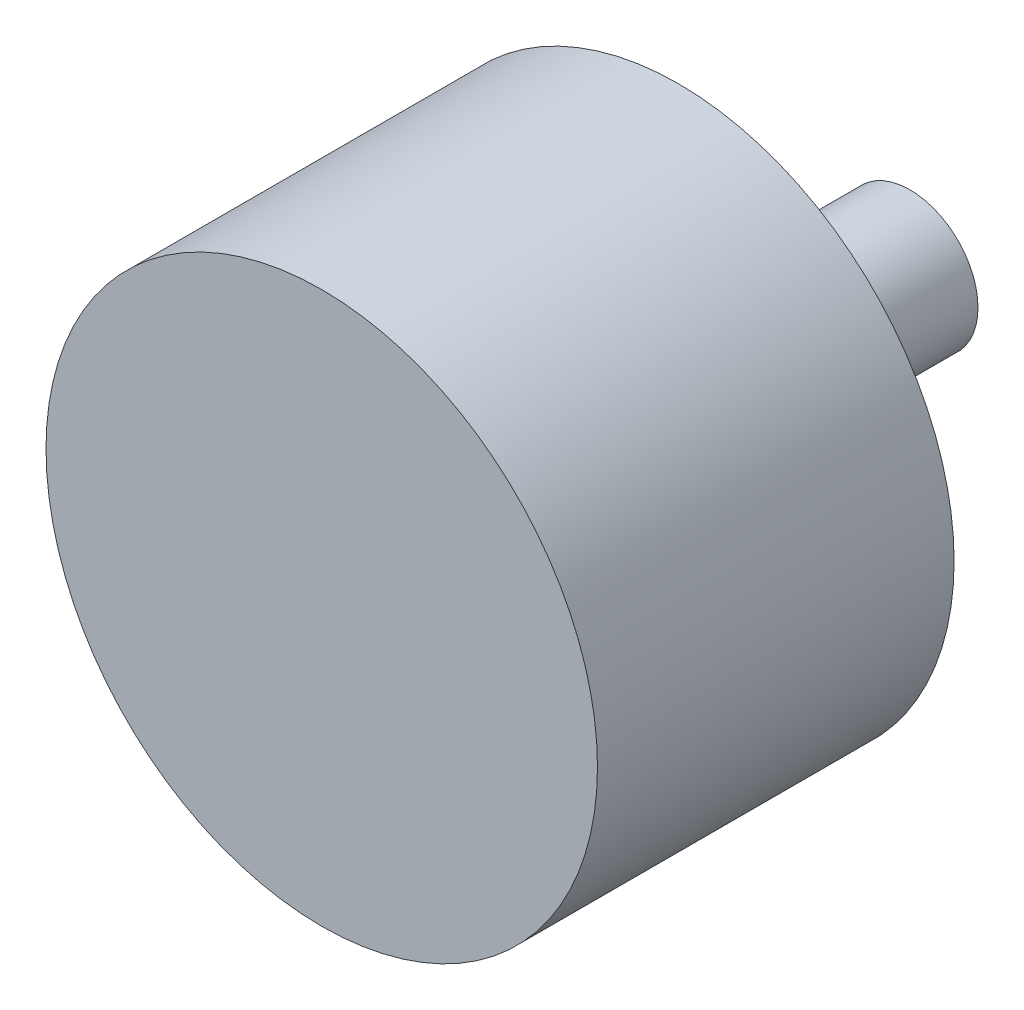
ISO-10303-21;
HEADER;
FILE_DESCRIPTION(('STEP AP214'),'2;1');
FILE_NAME('part.step','',(''),(''),'','','');
FILE_SCHEMA(('AUTOMOTIVE_DESIGN { 1 0 10303 214 1 1 1 1 }'));
ENDSEC;
DATA;
#1=APPLICATION_CONTEXT('core data for automotive mechanical design processes');
#2=APPLICATION_PROTOCOL_DEFINITION('international standard','automotive_design',2000,#1);
#3=PRODUCT_CONTEXT('',#1,'mechanical');
#4=PRODUCT('Part','Part','',(#3));
#5=PRODUCT_RELATED_PRODUCT_CATEGORY('part','',(#4));
#6=PRODUCT_DEFINITION_FORMATION('','',#4);
#7=PRODUCT_DEFINITION_CONTEXT('part definition',#1,'design');
#8=PRODUCT_DEFINITION('design','',#6,#7);
#9=PRODUCT_DEFINITION_SHAPE('','',#8);
#10=(LENGTH_UNIT() NAMED_UNIT(*) SI_UNIT(.MILLI.,.METRE.));
#11=(NAMED_UNIT(*) PLANE_ANGLE_UNIT() SI_UNIT($,.RADIAN.));
#12=(NAMED_UNIT(*) SI_UNIT($,.STERADIAN.) SOLID_ANGLE_UNIT());
#13=UNCERTAINTY_MEASURE_WITH_UNIT(LENGTH_MEASURE(1.E-05),#10,'distance_accuracy_value','');
#14=(GEOMETRIC_REPRESENTATION_CONTEXT(3) GLOBAL_UNCERTAINTY_ASSIGNED_CONTEXT((#13)) GLOBAL_UNIT_ASSIGNED_CONTEXT((#10,
#11,#12)) REPRESENTATION_CONTEXT('',''));
#15=CARTESIAN_POINT('',(0.,0.,0.));
#16=DIRECTION('',(0.,0.,1.));
#17=DIRECTION('',(1.,0.,0.));
#18=AXIS2_PLACEMENT_3D('',#15,#16,#17);
#19=CARTESIAN_POINT('',(0.,0.,0.));
#20=DIRECTION('',(0.,0.,-1.));
#21=DIRECTION('',(-1.,0.,0.));
#22=AXIS2_PLACEMENT_3D('',#19,#20,#21);
#23=PLANE('',#22);
#24=CARTESIAN_POINT('',(0.,0.,0.));
#25=DIRECTION('',(0.,0.,1.));
#26=DIRECTION('',(1.,0.,0.));
#27=AXIS2_PLACEMENT_3D('',#24,#25,#26);
#28=CIRCLE('',#27,19.05);
#29=CARTESIAN_POINT('',(19.05,0.,0.));
#30=VERTEX_POINT('',#29);
#31=EDGE_CURVE('E10',#30,#30,#28,.T.);
#32=ORIENTED_EDGE('',*,*,#31,.T.);
#33=EDGE_LOOP('',(#32));
#34=FACE_BOUND('',#33,.T.);
#35=ADVANCED_FACE('F32',(#34),#23,.F.);
#36=CARTESIAN_POINT('',(0.,0.,0.));
#37=DIRECTION('',(0.,0.,1.));
#38=DIRECTION('',(1.,0.,0.));
#39=AXIS2_PLACEMENT_3D('',#36,#37,#38);
#40=CYLINDRICAL_SURFACE('',#39,19.05);
#41=ORIENTED_EDGE('',*,*,#31,.F.);
#42=EDGE_LOOP('',(#41));
#43=FACE_BOUND('',#42,.T.);
#44=CARTESIAN_POINT('',(0.,0.,-24.638));
#45=DIRECTION('',(0.,0.,1.));
#46=DIRECTION('',(1.,0.,0.));
#47=AXIS2_PLACEMENT_3D('',#44,#45,#46);
#48=CIRCLE('',#47,19.05);
#49=CARTESIAN_POINT('',(19.05,0.,-24.638));
#50=VERTEX_POINT('',#49);
#51=EDGE_CURVE('E38',#50,#50,#48,.T.);
#52=ORIENTED_EDGE('',*,*,#51,.T.);
#53=EDGE_LOOP('',(#52));
#54=FACE_BOUND('',#53,.T.);
#55=ADVANCED_FACE('F70',(#43,#54),#40,.T.);
#56=CARTESIAN_POINT('',(0.,19.05,-24.638));
#57=DIRECTION('',(0.,0.,1.));
#58=DIRECTION('',(1.,0.,0.));
#59=AXIS2_PLACEMENT_3D('',#56,#57,#58);
#60=PLANE('',#59);
#61=ORIENTED_EDGE('',*,*,#51,.F.);
#62=EDGE_LOOP('',(#61));
#63=FACE_BOUND('',#62,.T.);
#64=CARTESIAN_POINT('',(0.,0.,-24.638));
#65=DIRECTION('',(0.,0.,1.));
#66=DIRECTION('',(1.,0.,0.));
#67=AXIS2_PLACEMENT_3D('',#64,#65,#66);
#68=CIRCLE('',#67,5.461);
#69=CARTESIAN_POINT('',(5.461,0.,-24.638));
#70=VERTEX_POINT('',#69);
#71=EDGE_CURVE('E42',#70,#70,#68,.T.);
#72=ORIENTED_EDGE('',*,*,#71,.T.);
#73=EDGE_LOOP('',(#72));
#74=FACE_BOUND('',#73,.T.);
#75=ADVANCED_FACE('F74',(#63,#74),#60,.F.);
#76=CARTESIAN_POINT('',(0.,0.,0.));
#77=DIRECTION('',(0.,0.,1.));
#78=DIRECTION('',(1.,0.,0.));
#79=AXIS2_PLACEMENT_3D('',#76,#77,#78);
#80=CYLINDRICAL_SURFACE('',#79,5.461);
#81=ORIENTED_EDGE('',*,*,#71,.F.);
#82=EDGE_LOOP('',(#81));
#83=FACE_BOUND('',#82,.T.);
#84=CARTESIAN_POINT('',(0.,0.,-30.48));
#85=DIRECTION('',(0.,0.,1.));
#86=DIRECTION('',(1.,0.,0.));
#87=AXIS2_PLACEMENT_3D('',#84,#85,#86);
#88=CIRCLE('',#87,5.461);
#89=CARTESIAN_POINT('',(5.461,0.,-30.48));
#90=VERTEX_POINT('',#89);
#91=EDGE_CURVE('E46',#90,#90,#88,.T.);
#92=ORIENTED_EDGE('',*,*,#91,.T.);
#93=EDGE_LOOP('',(#92));
#94=FACE_BOUND('',#93,.T.);
#95=ADVANCED_FACE('F79',(#83,#94),#80,.T.);
#96=CARTESIAN_POINT('',(0.,5.461,-30.48));
#97=DIRECTION('',(0.,0.,1.));
#98=DIRECTION('',(1.,0.,0.));
#99=AXIS2_PLACEMENT_3D('',#96,#97,#98);
#100=PLANE('',#99);
#101=ORIENTED_EDGE('',*,*,#91,.F.);
#102=EDGE_LOOP('',(#101));
#103=FACE_BOUND('',#102,.T.);
#104=CARTESIAN_POINT('',(0.,0.,-30.48));
#105=DIRECTION('',(0.,0.,1.));
#106=DIRECTION('',(1.,0.,0.));
#107=AXIS2_PLACEMENT_3D('',#104,#105,#106);
#108=CIRCLE('',#107,4.699);
#109=CARTESIAN_POINT('',(4.699,0.,-30.48));
#110=VERTEX_POINT('',#109);
#111=EDGE_CURVE('E51',#110,#110,#108,.T.);
#112=ORIENTED_EDGE('',*,*,#111,.T.);
#113=EDGE_LOOP('',(#112));
#114=FACE_BOUND('',#113,.T.);
#115=ADVANCED_FACE('F66',(#103,#114),#100,.F.);
#116=CARTESIAN_POINT('',(0.,0.,0.));
#117=DIRECTION('',(0.,0.,1.));
#118=DIRECTION('',(1.,0.,0.));
#119=AXIS2_PLACEMENT_3D('',#116,#117,#118);
#120=CYLINDRICAL_SURFACE('',#119,4.699);
#121=ORIENTED_EDGE('',*,*,#111,.F.);
#122=EDGE_LOOP('',(#121));
#123=FACE_BOUND('',#122,.T.);
#124=CARTESIAN_POINT('',(0.,0.,-40.64));
#125=DIRECTION('',(0.,0.,1.));
#126=DIRECTION('',(1.,0.,0.));
#127=AXIS2_PLACEMENT_3D('',#124,#125,#126);
#128=CIRCLE('',#127,4.699);
#129=CARTESIAN_POINT('',(4.699,0.,-40.64));
#130=VERTEX_POINT('',#129);
#131=EDGE_CURVE('E54',#130,#130,#128,.T.);
#132=ORIENTED_EDGE('',*,*,#131,.T.);
#133=EDGE_LOOP('',(#132));
#134=FACE_BOUND('',#133,.T.);
#135=ADVANCED_FACE('F58',(#123,#134),#120,.T.);
#136=CARTESIAN_POINT('',(0.,4.699,-40.64));
#137=DIRECTION('',(0.,0.,1.));
#138=DIRECTION('',(1.,0.,0.));
#139=AXIS2_PLACEMENT_3D('',#136,#137,#138);
#140=PLANE('',#139);
#141=ORIENTED_EDGE('',*,*,#131,.F.);
#142=EDGE_LOOP('',(#141));
#143=FACE_BOUND('',#142,.T.);
#144=ADVANCED_FACE('F60',(#143),#140,.F.);
#145=CLOSED_SHELL('',(#35,#55,#75,#95,#115,#135,#144));
#146=MANIFOLD_SOLID_BREP('B2',#145);
#147=ADVANCED_BREP_SHAPE_REPRESENTATION('',(#18,#146),#14);
#148=SHAPE_DEFINITION_REPRESENTATION(#9,#147);
ENDSEC;
END-ISO-10303-21;
